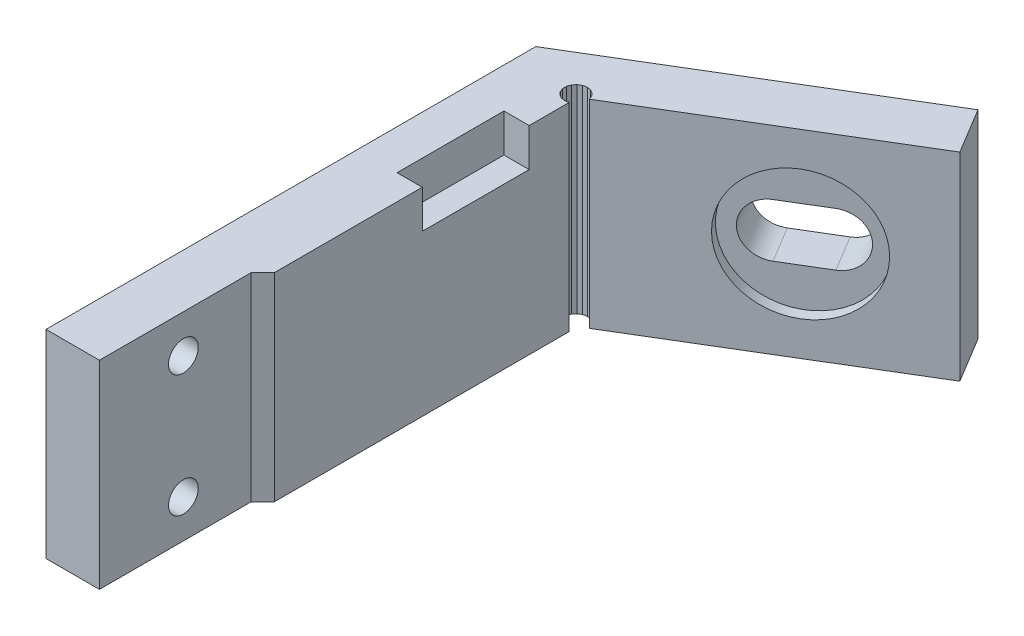
ISO-10303-21;
HEADER;
FILE_DESCRIPTION(('STEP AP214'),'2;1');
FILE_NAME('part.step','',(''),(''),'','','');
FILE_SCHEMA(('AUTOMOTIVE_DESIGN { 1 0 10303 214 1 1 1 1 }'));
ENDSEC;
DATA;
#1=APPLICATION_CONTEXT('core data for automotive mechanical design processes');
#2=APPLICATION_PROTOCOL_DEFINITION('international standard','automotive_design',2000,#1);
#3=PRODUCT_CONTEXT('',#1,'mechanical');
#4=PRODUCT('Part','Part','',(#3));
#5=PRODUCT_RELATED_PRODUCT_CATEGORY('part','',(#4));
#6=PRODUCT_DEFINITION_FORMATION('','',#4);
#7=PRODUCT_DEFINITION_CONTEXT('part definition',#1,'design');
#8=PRODUCT_DEFINITION('design','',#6,#7);
#9=PRODUCT_DEFINITION_SHAPE('','',#8);
#10=(LENGTH_UNIT() NAMED_UNIT(*) SI_UNIT(.MILLI.,.METRE.));
#11=(NAMED_UNIT(*) PLANE_ANGLE_UNIT() SI_UNIT($,.RADIAN.));
#12=(NAMED_UNIT(*) SI_UNIT($,.STERADIAN.) SOLID_ANGLE_UNIT());
#13=UNCERTAINTY_MEASURE_WITH_UNIT(LENGTH_MEASURE(1.E-05),#10,'distance_accuracy_value','');
#14=(GEOMETRIC_REPRESENTATION_CONTEXT(3) GLOBAL_UNCERTAINTY_ASSIGNED_CONTEXT((#13)) GLOBAL_UNIT_ASSIGNED_CONTEXT((#10,
#11,#12)) REPRESENTATION_CONTEXT('',''));
#15=CARTESIAN_POINT('',(0.,0.,0.));
#16=DIRECTION('',(0.,0.,1.));
#17=DIRECTION('',(1.,0.,0.));
#18=AXIS2_PLACEMENT_3D('',#15,#16,#17);
#19=CARTESIAN_POINT('',(20.8933360678516,-20.7,-41.4415255956456));
#20=DIRECTION('',(0.516709511568123,0.,0.856160779675775));
#21=DIRECTION('',(0.856160779675775,0.,-0.516709511568123));
#22=AXIS2_PLACEMENT_3D('',#19,#20,#21);
#23=CYLINDRICAL_SURFACE('',#22,3.5);
#24=CARTESIAN_POINT('',(16.7596599753066,-20.7,-48.2908118330518));
#25=DIRECTION('',(0.516709511568124,0.,0.856160779675775));
#26=DIRECTION('',(0.856160779675775,0.,-0.516709511568124));
#27=AXIS2_PLACEMENT_3D('',#24,#25,#26);
#28=CIRCLE('',#27,3.5);
#29=CARTESIAN_POINT('',(16.7596599753066,-17.2,-48.2908118330518));
#30=VERTEX_POINT('',#29);
#31=CARTESIAN_POINT('',(16.7596599753066,-24.2,-48.2908118330518));
#32=VERTEX_POINT('',#31);
#33=EDGE_CURVE('E251',#30,#32,#28,.F.);
#34=ORIENTED_EDGE('',*,*,#33,.T.);
#35=DIRECTION('',(-0.516709511568123,0.,-0.856160779675775));
#36=VECTOR('',#35,1.);
#37=CARTESIAN_POINT('',(20.8933360678516,-24.2,-41.4415255956456));
#38=LINE('',#37,#36);
#39=CARTESIAN_POINT('',(19.6015622889313,-24.2,-43.581927544835));
#40=VERTEX_POINT('',#39);
#41=EDGE_CURVE('E473',#40,#32,#38,.T.);
#42=ORIENTED_EDGE('',*,*,#41,.F.);
#43=CARTESIAN_POINT('',(19.6015622889313,-20.7,-43.581927544835));
#44=DIRECTION('',(0.516709511568124,0.,0.856160779675775));
#45=DIRECTION('',(0.856160779675775,0.,-0.516709511568124));
#46=AXIS2_PLACEMENT_3D('',#43,#44,#45);
#47=CIRCLE('',#46,3.5);
#48=CARTESIAN_POINT('',(19.6015622889313,-17.2,-43.581927544835));
#49=VERTEX_POINT('',#48);
#50=EDGE_CURVE('E260',#49,#40,#47,.F.);
#51=ORIENTED_EDGE('',*,*,#50,.F.);
#52=DIRECTION('',(-0.516709511568123,0.,-0.856160779675775));
#53=VECTOR('',#52,1.);
#54=CARTESIAN_POINT('',(20.8933360678516,-17.2,-41.4415255956456));
#55=LINE('',#54,#53);
#56=EDGE_CURVE('E475',#49,#30,#55,.T.);
#57=ORIENTED_EDGE('',*,*,#56,.T.);
#58=EDGE_LOOP('',(#34,#42,#51,#57));
#59=FACE_BOUND('',#58,.T.);
#60=ADVANCED_FACE('F43',(#59),#23,.F.);
#61=CARTESIAN_POINT('',(-8.92,-7.7,-32.7926427063358));
#62=DIRECTION('',(0.516709511568124,0.,0.856160779675775));
#63=DIRECTION('',(0.856160779675775,0.,-0.516709511568124));
#64=AXIS2_PLACEMENT_3D('',#61,#62,#63);
#65=PLANE('',#64);
#66=DIRECTION('',(-0.856160779675775,0.,0.516709511568124));
#67=VECTOR('',#66,1.);
#68=CARTESIAN_POINT('',(-8.92,-33.7,-32.7926427063358));
#69=LINE('',#68,#67);
#70=CARTESIAN_POINT('',(27.204821487351,-33.7,-54.5946678741829));
#71=VERTEX_POINT('',#70);
#72=CARTESIAN_POINT('',(-8.92,-33.7,-32.7926427063358));
#73=VERTEX_POINT('',#72);
#74=EDGE_CURVE('E343',#71,#73,#69,.T.);
#75=ORIENTED_EDGE('',*,*,#74,.T.);
#76=DIRECTION('',(0.,-1.,0.));
#77=VECTOR('',#76,1.);
#78=CARTESIAN_POINT('',(-8.92,-7.7,-32.7926427063358));
#79=LINE('',#78,#77);
#80=CARTESIAN_POINT('',(-8.92,-7.7,-32.7926427063358));
#81=VERTEX_POINT('',#80);
#82=EDGE_CURVE('E437',#81,#73,#79,.T.);
#83=ORIENTED_EDGE('',*,*,#82,.F.);
#84=DIRECTION('',(-0.856160779675775,0.,0.516709511568124));
#85=VECTOR('',#84,1.);
#86=CARTESIAN_POINT('',(-8.92,-7.7,-32.7926427063358));
#87=LINE('',#86,#85);
#88=CARTESIAN_POINT('',(27.204821487351,-7.7,-54.5946678741829));
#89=VERTEX_POINT('',#88);
#90=EDGE_CURVE('E300',#89,#81,#87,.T.);
#91=ORIENTED_EDGE('',*,*,#90,.F.);
#92=DIRECTION('',(0.,-1.,0.));
#93=VECTOR('',#92,1.);
#94=CARTESIAN_POINT('',(27.204821487351,-7.7,-54.5946678741829));
#95=LINE('',#94,#93);
#96=EDGE_CURVE('E445',#89,#71,#95,.T.);
#97=ORIENTED_EDGE('',*,*,#96,.T.);
#98=EDGE_LOOP('',(#75,#83,#91,#97));
#99=FACE_BOUND('',#98,.T.);
#100=DIRECTION('',(-0.856160779675775,0.,0.516709511568124));
#101=VECTOR('',#100,1.);
#102=CARTESIAN_POINT('',(-8.92,-24.2,-32.7926427063358));
#103=LINE('',#102,#101);
#104=CARTESIAN_POINT('',(11.6226952972519,-24.2,-45.190554763643));
#105=VERTEX_POINT('',#104);
#106=EDGE_CURVE('E70',#32,#105,#103,.T.);
#107=ORIENTED_EDGE('',*,*,#106,.F.);
#108=ORIENTED_EDGE('',*,*,#33,.F.);
#109=DIRECTION('',(-0.856160779675775,0.,0.516709511568124));
#110=VECTOR('',#109,1.);
#111=CARTESIAN_POINT('',(-8.92,-17.2,-32.7926427063358));
#112=LINE('',#111,#110);
#113=CARTESIAN_POINT('',(11.6226952972519,-17.2,-45.190554763643));
#114=VERTEX_POINT('',#113);
#115=EDGE_CURVE('E239',#30,#114,#112,.T.);
#116=ORIENTED_EDGE('',*,*,#115,.T.);
#117=CARTESIAN_POINT('',(11.6226952972519,-20.7,-45.190554763643));
#118=DIRECTION('',(0.516709511568124,0.,0.856160779675775));
#119=DIRECTION('',(0.856160779675775,0.,-0.516709511568124));
#120=AXIS2_PLACEMENT_3D('',#117,#118,#119);
#121=CIRCLE('',#120,3.5);
#122=EDGE_CURVE('E255',#105,#114,#121,.F.);
#123=ORIENTED_EDGE('',*,*,#122,.F.);
#124=EDGE_LOOP('',(#107,#108,#116,#123));
#125=FACE_BOUND('',#124,.T.);
#126=ADVANCED_FACE('F252',(#99,#125),#65,.F.);
#127=CARTESIAN_POINT('',(17.0330799499039,-20.7,-42.0317990101306));
#128=DIRECTION('',(0.516709511568124,0.,0.856160779675775));
#129=DIRECTION('',(0.856160779675775,0.,-0.516709511568124));
#130=AXIS2_PLACEMENT_3D('',#127,#128,#129);
#131=PLANE('',#130);
#132=CARTESIAN_POINT('',(17.0330799499039,-20.7,-42.0317990101306));
#133=DIRECTION('',(0.516709511568124,0.,0.856160779675775));
#134=DIRECTION('',(0.856160779675775,0.,-0.516709511568124));
#135=AXIS2_PLACEMENT_3D('',#132,#133,#134);
#136=CIRCLE('',#135,8.5);
#137=CARTESIAN_POINT('',(24.310446577148,-20.7,-46.4238298584597));
#138=VERTEX_POINT('',#137);
#139=EDGE_CURVE('E269',#138,#138,#136,.T.);
#140=ORIENTED_EDGE('',*,*,#139,.T.);
#141=EDGE_LOOP('',(#140));
#142=FACE_BOUND('',#141,.T.);
#143=ORIENTED_EDGE('',*,*,#50,.T.);
#144=DIRECTION('',(-0.856160779675775,0.,0.516709511568124));
#145=VECTOR('',#144,1.);
#146=CARTESIAN_POINT('',(17.0330799499039,-24.2,-42.0317990101306));
#147=LINE('',#146,#145);
#148=CARTESIAN_POINT('',(14.4645976108766,-24.2,-40.4816704754263));
#149=VERTEX_POINT('',#148);
#150=EDGE_CURVE('E253',#40,#149,#147,.T.);
#151=ORIENTED_EDGE('',*,*,#150,.T.);
#152=CARTESIAN_POINT('',(14.4645976108766,-20.7,-40.4816704754263));
#153=DIRECTION('',(0.516709511568124,0.,0.856160779675775));
#154=DIRECTION('',(0.856160779675775,0.,-0.516709511568124));
#155=AXIS2_PLACEMENT_3D('',#152,#153,#154);
#156=CIRCLE('',#155,3.5);
#157=CARTESIAN_POINT('',(14.4645976108766,-17.2,-40.4816704754263));
#158=VERTEX_POINT('',#157);
#159=EDGE_CURVE('E258',#149,#158,#156,.F.);
#160=ORIENTED_EDGE('',*,*,#159,.T.);
#161=DIRECTION('',(-0.856160779675775,0.,0.516709511568124));
#162=VECTOR('',#161,1.);
#163=CARTESIAN_POINT('',(17.0330799499039,-17.2,-42.0317990101306));
#164=LINE('',#163,#162);
#165=EDGE_CURVE('E58',#49,#158,#164,.T.);
#166=ORIENTED_EDGE('',*,*,#165,.F.);
#167=EDGE_LOOP('',(#143,#151,#160,#166));
#168=FACE_BOUND('',#167,.T.);
#169=ADVANCED_FACE('F476',(#142,#168),#131,.T.);
#170=CARTESIAN_POINT('',(15.7563713897969,-20.7,-38.3412685262368));
#171=DIRECTION('',(0.516709511568124,0.,0.856160779675775));
#172=DIRECTION('',(0.856160779675775,0.,-0.516709511568124));
#173=AXIS2_PLACEMENT_3D('',#170,#171,#172);
#174=CYLINDRICAL_SURFACE('',#173,3.5);
#175=DIRECTION('',(0.516709511568124,0.,0.856160779675775));
#176=VECTOR('',#175,1.);
#177=CARTESIAN_POINT('',(15.7563713897969,-24.2,-38.3412685262368));
#178=LINE('',#177,#176);
#179=EDGE_CURVE('E11',#105,#149,#178,.T.);
#180=ORIENTED_EDGE('',*,*,#179,.F.);
#181=ORIENTED_EDGE('',*,*,#122,.T.);
#182=DIRECTION('',(0.516709511568124,0.,0.856160779675775));
#183=VECTOR('',#182,1.);
#184=CARTESIAN_POINT('',(15.7563713897969,-17.2,-38.3412685262368));
#185=LINE('',#184,#183);
#186=EDGE_CURVE('E55',#114,#158,#185,.T.);
#187=ORIENTED_EDGE('',*,*,#186,.T.);
#188=ORIENTED_EDGE('',*,*,#159,.F.);
#189=EDGE_LOOP('',(#180,#181,#187,#188));
#190=FACE_BOUND('',#189,.T.);
#191=ADVANCED_FACE('F256',(#190),#174,.F.);
#192=CARTESIAN_POINT('',(30.8217880683279,-7.7,-48.6015424164524));
#193=DIRECTION('',(-0.516709511568124,0.,-0.856160779675775));
#194=DIRECTION('',(-0.856160779675775,0.,0.516709511568124));
#195=AXIS2_PLACEMENT_3D('',#192,#193,#194);
#196=PLANE('',#195);
#197=CARTESIAN_POINT('',(17.8081442172561,-20.7,-40.747557840617));
#198=DIRECTION('',(-0.516709511568124,0.,-0.856160779675775));
#199=DIRECTION('',(-0.856160779675775,0.,0.516709511568124));
#200=AXIS2_PLACEMENT_3D('',#197,#198,#199);
#201=CIRCLE('',#200,8.5);
#202=CARTESIAN_POINT('',(10.530777590012,-20.7,-36.3555269922879));
#203=VERTEX_POINT('',#202);
#204=EDGE_CURVE('E268',#203,#203,#201,.F.);
#205=ORIENTED_EDGE('',*,*,#204,.F.);
#206=EDGE_LOOP('',(#205));
#207=FACE_BOUND('',#206,.T.);
#208=DIRECTION('',(0.856160779675775,0.,-0.516709511568124));
#209=VECTOR('',#208,1.);
#210=CARTESIAN_POINT('',(30.8217880683279,-33.7,-48.6015424164524));
#211=LINE('',#210,#209);
#212=CARTESIAN_POINT('',(0.551289683386541,-33.7,-30.3327139362108));
#213=VERTEX_POINT('',#212);
#214=CARTESIAN_POINT('',(30.8217880683279,-33.7,-48.6015424164524));
#215=VERTEX_POINT('',#214);
#216=EDGE_CURVE('E288',#213,#215,#211,.T.);
#217=ORIENTED_EDGE('',*,*,#216,.T.);
#218=DIRECTION('',(0.,-1.,0.));
#219=VECTOR('',#218,1.);
#220=CARTESIAN_POINT('',(30.8217880683279,-7.7,-48.6015424164524));
#221=LINE('',#220,#219);
#222=CARTESIAN_POINT('',(30.8217880683279,-7.7,-48.6015424164524));
#223=VERTEX_POINT('',#222);
#224=EDGE_CURVE('E444',#223,#215,#221,.T.);
#225=ORIENTED_EDGE('',*,*,#224,.F.);
#226=DIRECTION('',(0.856160779675775,0.,-0.516709511568124));
#227=VECTOR('',#226,1.);
#228=CARTESIAN_POINT('',(30.8217880683279,-7.7,-48.6015424164524));
#229=LINE('',#228,#227);
#230=CARTESIAN_POINT('',(0.551289683386541,-7.7,-30.3327139362108));
#231=VERTEX_POINT('',#230);
#232=EDGE_CURVE('E293',#231,#223,#229,.T.);
#233=ORIENTED_EDGE('',*,*,#232,.F.);
#234=DIRECTION('',(0.,-1.,0.));
#235=VECTOR('',#234,1.);
#236=CARTESIAN_POINT('',(0.551289683386541,-7.7,-30.3327139362108));
#237=LINE('',#236,#235);
#238=EDGE_CURVE('E339',#231,#213,#237,.T.);
#239=ORIENTED_EDGE('',*,*,#238,.T.);
#240=EDGE_LOOP('',(#217,#225,#233,#239));
#241=FACE_BOUND('',#240,.T.);
#242=ADVANCED_FACE('F44',(#207,#241),#196,.F.);
#243=CARTESIAN_POINT('',(27.204821487351,-7.7,-54.5946678741829));
#244=DIRECTION('',(-0.856160779675776,0.,0.516709511568123));
#245=DIRECTION('',(0.516709511568123,0.,0.856160779675776));
#246=AXIS2_PLACEMENT_3D('',#243,#244,#245);
#247=PLANE('',#246);
#248=DIRECTION('',(-0.516709511568123,0.,-0.856160779675776));
#249=VECTOR('',#248,1.);
#250=CARTESIAN_POINT('',(27.204821487351,-33.7,-54.5946678741829));
#251=LINE('',#250,#249);
#252=EDGE_CURVE('E341',#215,#71,#251,.T.);
#253=ORIENTED_EDGE('',*,*,#252,.T.);
#254=ORIENTED_EDGE('',*,*,#96,.F.);
#255=DIRECTION('',(-0.516709511568123,0.,-0.856160779675776));
#256=VECTOR('',#255,1.);
#257=CARTESIAN_POINT('',(27.204821487351,-7.7,-54.5946678741829));
#258=LINE('',#257,#256);
#259=EDGE_CURVE('E295',#223,#89,#258,.T.);
#260=ORIENTED_EDGE('',*,*,#259,.F.);
#261=ORIENTED_EDGE('',*,*,#224,.T.);
#262=EDGE_LOOP('',(#253,#254,#260,#261));
#263=FACE_BOUND('',#262,.T.);
#264=ADVANCED_FACE('F598',(#263),#247,.F.);
#265=CARTESIAN_POINT('',(-8.92,-7.7,31.37));
#266=DIRECTION('',(1.,0.,0.));
#267=DIRECTION('',(0.,0.,-1.));
#268=AXIS2_PLACEMENT_3D('',#265,#266,#267);
#269=PLANE('',#268);
#270=CARTESIAN_POINT('',(-8.92,-28.7,20.375));
#271=DIRECTION('',(1.,0.,0.));
#272=DIRECTION('',(0.,0.,-1.));
#273=AXIS2_PLACEMENT_3D('',#270,#271,#272);
#274=CIRCLE('',#273,1.95);
#275=CARTESIAN_POINT('',(-8.92,-28.7,18.425));
#276=VERTEX_POINT('',#275);
#277=EDGE_CURVE('E469',#276,#276,#274,.T.);
#278=ORIENTED_EDGE('',*,*,#277,.T.);
#279=EDGE_LOOP('',(#278));
#280=FACE_BOUND('',#279,.T.);
#281=CARTESIAN_POINT('',(-8.92,-12.7,20.375));
#282=DIRECTION('',(1.,0.,0.));
#283=DIRECTION('',(0.,0.,-1.));
#284=AXIS2_PLACEMENT_3D('',#281,#282,#283);
#285=CIRCLE('',#284,1.95);
#286=CARTESIAN_POINT('',(-8.92,-12.7,18.425));
#287=VERTEX_POINT('',#286);
#288=EDGE_CURVE('E462',#287,#287,#285,.T.);
#289=ORIENTED_EDGE('',*,*,#288,.T.);
#290=EDGE_LOOP('',(#289));
#291=FACE_BOUND('',#290,.T.);
#292=DIRECTION('',(0.,0.,1.));
#293=VECTOR('',#292,1.);
#294=CARTESIAN_POINT('',(-8.92,-33.7,31.37));
#295=LINE('',#294,#293);
#296=CARTESIAN_POINT('',(-8.92,-33.7,31.37));
#297=VERTEX_POINT('',#296);
#298=EDGE_CURVE('E347',#73,#297,#295,.T.);
#299=ORIENTED_EDGE('',*,*,#298,.T.);
#300=DIRECTION('',(0.,-1.,0.));
#301=VECTOR('',#300,1.);
#302=CARTESIAN_POINT('',(-8.92,-7.7,31.37));
#303=LINE('',#302,#301);
#304=CARTESIAN_POINT('',(-8.92,-7.7,31.37));
#305=VERTEX_POINT('',#304);
#306=EDGE_CURVE('E436',#305,#297,#303,.T.);
#307=ORIENTED_EDGE('',*,*,#306,.F.);
#308=DIRECTION('',(0.,0.,1.));
#309=VECTOR('',#308,1.);
#310=CARTESIAN_POINT('',(-8.92,-7.7,31.37));
#311=LINE('',#310,#309);
#312=EDGE_CURVE('E299',#81,#305,#311,.T.);
#313=ORIENTED_EDGE('',*,*,#312,.F.);
#314=ORIENTED_EDGE('',*,*,#82,.T.);
#315=EDGE_LOOP('',(#299,#307,#313,#314));
#316=FACE_BOUND('',#315,.T.);
#317=ADVANCED_FACE('F600',(#280,#291,#316),#269,.F.);
#318=CARTESIAN_POINT('',(-1.91999999999999,-7.7,31.37));
#319=DIRECTION('',(0.,0.,-1.));
#320=DIRECTION('',(-1.,0.,0.));
#321=AXIS2_PLACEMENT_3D('',#318,#319,#320);
#322=PLANE('',#321);
#323=DIRECTION('',(1.,0.,0.));
#324=VECTOR('',#323,1.);
#325=CARTESIAN_POINT('',(-1.91999999999999,-33.7,31.37));
#326=LINE('',#325,#324);
#327=CARTESIAN_POINT('',(-1.91999999999999,-33.7,31.37));
#328=VERTEX_POINT('',#327);
#329=EDGE_CURVE('E348',#297,#328,#326,.T.);
#330=ORIENTED_EDGE('',*,*,#329,.T.);
#331=DIRECTION('',(0.,-1.,0.));
#332=VECTOR('',#331,1.);
#333=CARTESIAN_POINT('',(-1.91999999999999,-7.7,31.37));
#334=LINE('',#333,#332);
#335=CARTESIAN_POINT('',(-1.91999999999999,-7.7,31.37));
#336=VERTEX_POINT('',#335);
#337=EDGE_CURVE('E433',#336,#328,#334,.T.);
#338=ORIENTED_EDGE('',*,*,#337,.F.);
#339=DIRECTION('',(1.,0.,0.));
#340=VECTOR('',#339,1.);
#341=CARTESIAN_POINT('',(-1.91999999999999,-7.7,31.37));
#342=LINE('',#341,#340);
#343=EDGE_CURVE('E301',#305,#336,#342,.T.);
#344=ORIENTED_EDGE('',*,*,#343,.F.);
#345=ORIENTED_EDGE('',*,*,#306,.T.);
#346=EDGE_LOOP('',(#330,#338,#344,#345));
#347=FACE_BOUND('',#346,.T.);
#348=ADVANCED_FACE('F595',(#347),#322,.F.);
#349=CARTESIAN_POINT('',(-1.91999999999999,-7.7,11.5));
#350=DIRECTION('',(-1.,0.,0.));
#351=DIRECTION('',(0.,0.,1.));
#352=AXIS2_PLACEMENT_3D('',#349,#350,#351);
#353=PLANE('',#352);
#354=CARTESIAN_POINT('',(-1.91999999999999,-28.7,20.375));
#355=DIRECTION('',(-1.,0.,0.));
#356=DIRECTION('',(0.,0.,1.));
#357=AXIS2_PLACEMENT_3D('',#354,#355,#356);
#358=CIRCLE('',#357,1.95);
#359=CARTESIAN_POINT('',(-1.91999999999999,-28.7,22.325));
#360=VERTEX_POINT('',#359);
#361=EDGE_CURVE('E50',#360,#360,#358,.T.);
#362=ORIENTED_EDGE('',*,*,#361,.T.);
#363=EDGE_LOOP('',(#362));
#364=FACE_BOUND('',#363,.T.);
#365=CARTESIAN_POINT('',(-1.91999999999999,-12.7,20.375));
#366=DIRECTION('',(-1.,0.,0.));
#367=DIRECTION('',(0.,0.,1.));
#368=AXIS2_PLACEMENT_3D('',#365,#366,#367);
#369=CIRCLE('',#368,1.95);
#370=CARTESIAN_POINT('',(-1.91999999999999,-12.7,22.325));
#371=VERTEX_POINT('',#370);
#372=EDGE_CURVE('E459',#371,#371,#369,.T.);
#373=ORIENTED_EDGE('',*,*,#372,.T.);
#374=EDGE_LOOP('',(#373));
#375=FACE_BOUND('',#374,.T.);
#376=DIRECTION('',(0.,0.,-1.));
#377=VECTOR('',#376,1.);
#378=CARTESIAN_POINT('',(-1.91999999999999,-33.7,11.5));
#379=LINE('',#378,#377);
#380=CARTESIAN_POINT('',(-1.91999999999999,-33.7,11.5));
#381=VERTEX_POINT('',#380);
#382=EDGE_CURVE('E346',#328,#381,#379,.T.);
#383=ORIENTED_EDGE('',*,*,#382,.T.);
#384=DIRECTION('',(0.,-1.,0.));
#385=VECTOR('',#384,1.);
#386=CARTESIAN_POINT('',(-1.91999999999999,-7.7,11.5));
#387=LINE('',#386,#385);
#388=CARTESIAN_POINT('',(-1.91999999999999,-7.7,11.5));
#389=VERTEX_POINT('',#388);
#390=EDGE_CURVE('E427',#389,#381,#387,.T.);
#391=ORIENTED_EDGE('',*,*,#390,.F.);
#392=DIRECTION('',(0.,0.,-1.));
#393=VECTOR('',#392,1.);
#394=CARTESIAN_POINT('',(-1.91999999999999,-7.7,11.5));
#395=LINE('',#394,#393);
#396=EDGE_CURVE('E303',#336,#389,#395,.T.);
#397=ORIENTED_EDGE('',*,*,#396,.F.);
#398=ORIENTED_EDGE('',*,*,#337,.T.);
#399=EDGE_LOOP('',(#383,#391,#397,#398));
#400=FACE_BOUND('',#399,.T.);
#401=ADVANCED_FACE('F589',(#364,#375,#400),#353,.F.);
#402=CARTESIAN_POINT('',(-0.4,-7.7,9.98));
#403=DIRECTION('',(-0.707106781186547,0.,-0.707106781186548));
#404=DIRECTION('',(-0.707106781186548,0.,0.707106781186547));
#405=AXIS2_PLACEMENT_3D('',#402,#403,#404);
#406=PLANE('',#405);
#407=DIRECTION('',(0.707106781186548,0.,-0.707106781186547));
#408=VECTOR('',#407,1.);
#409=CARTESIAN_POINT('',(-0.4,-33.7,9.98));
#410=LINE('',#409,#408);
#411=CARTESIAN_POINT('',(-0.4,-33.7,9.98));
#412=VERTEX_POINT('',#411);
#413=EDGE_CURVE('E354',#381,#412,#410,.T.);
#414=ORIENTED_EDGE('',*,*,#413,.T.);
#415=DIRECTION('',(0.,-1.,0.));
#416=VECTOR('',#415,1.);
#417=CARTESIAN_POINT('',(-0.4,-7.7,9.98));
#418=LINE('',#417,#416);
#419=CARTESIAN_POINT('',(-0.4,-7.7,9.98));
#420=VERTEX_POINT('',#419);
#421=EDGE_CURVE('E430',#420,#412,#418,.T.);
#422=ORIENTED_EDGE('',*,*,#421,.F.);
#423=DIRECTION('',(0.707106781186548,0.,-0.707106781186547));
#424=VECTOR('',#423,1.);
#425=CARTESIAN_POINT('',(-0.4,-7.7,9.98));
#426=LINE('',#425,#424);
#427=EDGE_CURVE('E304',#389,#420,#426,.T.);
#428=ORIENTED_EDGE('',*,*,#427,.F.);
#429=ORIENTED_EDGE('',*,*,#390,.T.);
#430=EDGE_LOOP('',(#414,#422,#428,#429));
#431=FACE_BOUND('',#430,.T.);
#432=ADVANCED_FACE('F582',(#431),#406,.F.);
#433=CARTESIAN_POINT('',(-0.399999999999999,-7.7,-28.6474812727905));
#434=DIRECTION('',(-1.,0.,0.));
#435=DIRECTION('',(0.,0.,1.));
#436=AXIS2_PLACEMENT_3D('',#433,#434,#435);
#437=PLANE('',#436);
#438=DIRECTION('',(0.,0.,1.));
#439=VECTOR('',#438,1.);
#440=CARTESIAN_POINT('',(-0.399999999999999,-12.7,-28.6474812727905));
#441=LINE('',#440,#439);
#442=CARTESIAN_POINT('',(-0.4,-12.7,-23.4));
#443=VERTEX_POINT('',#442);
#444=CARTESIAN_POINT('',(-0.400000000000001,-12.7,-9.4));
#445=VERTEX_POINT('',#444);
#446=EDGE_CURVE('E246',#443,#445,#441,.T.);
#447=ORIENTED_EDGE('',*,*,#446,.T.);
#448=DIRECTION('',(0.,1.,0.));
#449=VECTOR('',#448,1.);
#450=CARTESIAN_POINT('',(-0.4,-7.7,-9.4));
#451=LINE('',#450,#449);
#452=CARTESIAN_POINT('',(-0.4,-7.7,-9.4));
#453=VERTEX_POINT('',#452);
#454=EDGE_CURVE('E289',#445,#453,#451,.T.);
#455=ORIENTED_EDGE('',*,*,#454,.T.);
#456=DIRECTION('',(0.,0.,-1.));
#457=VECTOR('',#456,1.);
#458=CARTESIAN_POINT('',(-0.399999999999999,-7.7,-28.6474812727905));
#459=LINE('',#458,#457);
#460=EDGE_CURVE('E308',#420,#453,#459,.T.);
#461=ORIENTED_EDGE('',*,*,#460,.F.);
#462=ORIENTED_EDGE('',*,*,#421,.T.);
#463=DIRECTION('',(0.,0.,-1.));
#464=VECTOR('',#463,1.);
#465=CARTESIAN_POINT('',(-0.399999999999999,-33.7,-28.6474812727905));
#466=LINE('',#465,#464);
#467=CARTESIAN_POINT('',(-0.399999999999999,-33.7,-28.6474812727905));
#468=VERTEX_POINT('',#467);
#469=EDGE_CURVE('E351',#412,#468,#466,.T.);
#470=ORIENTED_EDGE('',*,*,#469,.T.);
#471=DIRECTION('',(0.,-1.,0.));
#472=VECTOR('',#471,1.);
#473=CARTESIAN_POINT('',(-0.399999999999999,-7.7,-28.6474812727905));
#474=LINE('',#473,#472);
#475=CARTESIAN_POINT('',(-0.399999999999999,-7.7,-28.6474812727905));
#476=VERTEX_POINT('',#475);
#477=EDGE_CURVE('E425',#476,#468,#474,.T.);
#478=ORIENTED_EDGE('',*,*,#477,.F.);
#479=CARTESIAN_POINT('',(-0.4,-7.7,-23.4));
#480=VERTEX_POINT('',#479);
#481=EDGE_CURVE('E310',#480,#476,#459,.T.);
#482=ORIENTED_EDGE('',*,*,#481,.F.);
#483=DIRECTION('',(0.,-1.,0.));
#484=VECTOR('',#483,1.);
#485=CARTESIAN_POINT('',(-0.399999999999999,-7.7,-23.4));
#486=LINE('',#485,#484);
#487=EDGE_CURVE('E285',#480,#443,#486,.T.);
#488=ORIENTED_EDGE('',*,*,#487,.T.);
#489=EDGE_LOOP('',(#447,#455,#461,#462,#470,#478,#482,#488));
#490=FACE_BOUND('',#489,.T.);
#491=ADVANCED_FACE('F584',(#490),#437,.F.);
#492=CARTESIAN_POINT('',(-0.9117726301264,-7.7,-28.5535752199289));
#493=DIRECTION('',(0.180478610290129,0.,0.983578909507389));
#494=DIRECTION('',(0.983578909507389,0.,-0.180478610290129));
#495=AXIS2_PLACEMENT_3D('',#492,#493,#494);
#496=PLANE('',#495);
#497=DIRECTION('',(-0.983578909507389,0.,0.180478610290129));
#498=VECTOR('',#497,1.);
#499=CARTESIAN_POINT('',(-0.9117726301264,-33.7,-28.5535752199289));
#500=LINE('',#499,#498);
#501=CARTESIAN_POINT('',(-0.9117726301264,-33.7,-28.5535752199289));
#502=VERTEX_POINT('',#501);
#503=EDGE_CURVE('E358',#468,#502,#500,.T.);
#504=ORIENTED_EDGE('',*,*,#503,.T.);
#505=DIRECTION('',(0.,-1.,0.));
#506=VECTOR('',#505,1.);
#507=CARTESIAN_POINT('',(-0.9117726301264,-7.7,-28.5535752199289));
#508=LINE('',#507,#506);
#509=CARTESIAN_POINT('',(-0.9117726301264,-7.7,-28.5535752199289));
#510=VERTEX_POINT('',#509);
#511=EDGE_CURVE('E423',#510,#502,#508,.T.);
#512=ORIENTED_EDGE('',*,*,#511,.F.);
#513=DIRECTION('',(-0.983578909507389,0.,0.180478610290129));
#514=VECTOR('',#513,1.);
#515=CARTESIAN_POINT('',(-0.9117726301264,-7.7,-28.5535752199289));
#516=LINE('',#515,#514);
#517=EDGE_CURVE('E311',#476,#510,#516,.T.);
#518=ORIENTED_EDGE('',*,*,#517,.F.);
#519=ORIENTED_EDGE('',*,*,#477,.T.);
#520=EDGE_LOOP('',(#504,#512,#518,#519));
#521=FACE_BOUND('',#520,.T.);
#522=ADVANCED_FACE('F580',(#521),#496,.F.);
#523=CARTESIAN_POINT('',(-1.42483619137929,-7.7,-28.640150931448));
#524=DIRECTION('',(-0.166390382980746,0.,0.986059957838022));
#525=DIRECTION('',(0.986059957838022,0.,0.166390382980746));
#526=AXIS2_PLACEMENT_3D('',#523,#524,#525);
#527=PLANE('',#526);
#528=DIRECTION('',(-0.986059957838022,0.,-0.166390382980746));
#529=VECTOR('',#528,1.);
#530=CARTESIAN_POINT('',(-1.42483619137929,-33.7,-28.640150931448));
#531=LINE('',#530,#529);
#532=CARTESIAN_POINT('',(-1.42483619137929,-33.7,-28.640150931448));
#533=VERTEX_POINT('',#532);
#534=EDGE_CURVE('E356',#502,#533,#531,.T.);
#535=ORIENTED_EDGE('',*,*,#534,.T.);
#536=DIRECTION('',(0.,-1.,0.));
#537=VECTOR('',#536,1.);
#538=CARTESIAN_POINT('',(-1.42483619137929,-7.7,-28.640150931448));
#539=LINE('',#538,#537);
#540=CARTESIAN_POINT('',(-1.42483619137929,-7.7,-28.640150931448));
#541=VERTEX_POINT('',#540);
#542=EDGE_CURVE('E420',#541,#533,#539,.T.);
#543=ORIENTED_EDGE('',*,*,#542,.F.);
#544=DIRECTION('',(-0.986059957838022,0.,-0.166390382980746));
#545=VECTOR('',#544,1.);
#546=CARTESIAN_POINT('',(-1.42483619137929,-7.7,-28.640150931448));
#547=LINE('',#546,#545);
#548=EDGE_CURVE('E312',#510,#541,#547,.T.);
#549=ORIENTED_EDGE('',*,*,#548,.F.);
#550=ORIENTED_EDGE('',*,*,#511,.T.);
#551=EDGE_LOOP('',(#535,#543,#549,#550));
#552=FACE_BOUND('',#551,.T.);
#553=ADVANCED_FACE('F572',(#552),#527,.F.);
#554=CARTESIAN_POINT('',(-1.87745669344831,-7.7,-28.8967912494367));
#555=DIRECTION('',(-0.493238577531129,0.,0.869894077250253));
#556=DIRECTION('',(0.869894077250253,0.,0.493238577531129));
#557=AXIS2_PLACEMENT_3D('',#554,#555,#556);
#558=PLANE('',#557);
#559=DIRECTION('',(-0.869894077250252,0.,-0.493238577531129));
#560=VECTOR('',#559,1.);
#561=CARTESIAN_POINT('',(-1.87745669344831,-33.7,-28.8967912494367));
#562=LINE('',#561,#560);
#563=CARTESIAN_POINT('',(-1.87745669344831,-33.7,-28.8967912494367));
#564=VERTEX_POINT('',#563);
#565=EDGE_CURVE('E359',#533,#564,#562,.T.);
#566=ORIENTED_EDGE('',*,*,#565,.T.);
#567=DIRECTION('',(0.,-1.,0.));
#568=VECTOR('',#567,1.);
#569=CARTESIAN_POINT('',(-1.87745669344831,-7.7,-28.8967912494367));
#570=LINE('',#569,#568);
#571=CARTESIAN_POINT('',(-1.87745669344831,-7.7,-28.8967912494367));
#572=VERTEX_POINT('',#571);
#573=EDGE_CURVE('E411',#572,#564,#570,.T.);
#574=ORIENTED_EDGE('',*,*,#573,.F.);
#575=DIRECTION('',(-0.869894077250252,0.,-0.493238577531129));
#576=VECTOR('',#575,1.);
#577=CARTESIAN_POINT('',(-1.87745669344831,-7.7,-28.8967912494367));
#578=LINE('',#577,#576);
#579=EDGE_CURVE('E314',#541,#572,#578,.T.);
#580=ORIENTED_EDGE('',*,*,#579,.F.);
#581=ORIENTED_EDGE('',*,*,#542,.T.);
#582=EDGE_LOOP('',(#566,#574,#580,#581));
#583=FACE_BOUND('',#582,.T.);
#584=ADVANCED_FACE('F567',(#583),#558,.F.);
#585=CARTESIAN_POINT('',(-2.21517291203457,-7.7,-29.2926161190625));
#586=DIRECTION('',(-0.760738208149895,0.,0.649058840676935));
#587=DIRECTION('',(0.649058840676935,0.,0.760738208149895));
#588=AXIS2_PLACEMENT_3D('',#585,#586,#587);
#589=PLANE('',#588);
#590=DIRECTION('',(-0.649058840676935,0.,-0.760738208149895));
#591=VECTOR('',#590,1.);
#592=CARTESIAN_POINT('',(-2.21517291203457,-33.7,-29.2926161190625));
#593=LINE('',#592,#591);
#594=CARTESIAN_POINT('',(-2.21517291203457,-33.7,-29.2926161190625));
#595=VERTEX_POINT('',#594);
#596=EDGE_CURVE('E365',#564,#595,#593,.T.);
#597=ORIENTED_EDGE('',*,*,#596,.T.);
#598=DIRECTION('',(0.,-1.,0.));
#599=VECTOR('',#598,1.);
#600=CARTESIAN_POINT('',(-2.21517291203457,-7.7,-29.2926161190625));
#601=LINE('',#600,#599);
#602=CARTESIAN_POINT('',(-2.21517291203457,-7.7,-29.2926161190625));
#603=VERTEX_POINT('',#602);
#604=EDGE_CURVE('E415',#603,#595,#601,.T.);
#605=ORIENTED_EDGE('',*,*,#604,.F.);
#606=DIRECTION('',(-0.649058840676935,0.,-0.760738208149895));
#607=VECTOR('',#606,1.);
#608=CARTESIAN_POINT('',(-2.21517291203457,-7.7,-29.2926161190625));
#609=LINE('',#608,#607);
#610=EDGE_CURVE('E320',#572,#603,#609,.T.);
#611=ORIENTED_EDGE('',*,*,#610,.F.);
#612=ORIENTED_EDGE('',*,*,#573,.T.);
#613=EDGE_LOOP('',(#597,#605,#611,#612));
#614=FACE_BOUND('',#613,.T.);
#615=ADVANCED_FACE('F564',(#614),#589,.F.);
#616=CARTESIAN_POINT('',(-2.39734939504136,-7.7,-29.7799982081362));
#617=DIRECTION('',(-0.936702581312546,0.,0.350126083236328));
#618=DIRECTION('',(0.350126083236328,0.,0.936702581312547));
#619=AXIS2_PLACEMENT_3D('',#616,#617,#618);
#620=PLANE('',#619);
#621=DIRECTION('',(-0.350126083236328,0.,-0.936702581312546));
#622=VECTOR('',#621,1.);
#623=CARTESIAN_POINT('',(-2.39734939504136,-33.7,-29.7799982081362));
#624=LINE('',#623,#622);
#625=CARTESIAN_POINT('',(-2.39734939504136,-33.7,-29.7799982081362));
#626=VERTEX_POINT('',#625);
#627=EDGE_CURVE('E364',#595,#626,#624,.T.);
#628=ORIENTED_EDGE('',*,*,#627,.T.);
#629=DIRECTION('',(0.,-1.,0.));
#630=VECTOR('',#629,1.);
#631=CARTESIAN_POINT('',(-2.39734939504136,-7.7,-29.7799982081362));
#632=LINE('',#631,#630);
#633=CARTESIAN_POINT('',(-2.39734939504136,-7.7,-29.7799982081362));
#634=VERTEX_POINT('',#633);
#635=EDGE_CURVE('E408',#634,#626,#632,.T.);
#636=ORIENTED_EDGE('',*,*,#635,.F.);
#637=DIRECTION('',(-0.350126083236328,0.,-0.936702581312546));
#638=VECTOR('',#637,1.);
#639=CARTESIAN_POINT('',(-2.39734939504136,-7.7,-29.7799982081362));
#640=LINE('',#639,#638);
#641=EDGE_CURVE('E316',#603,#634,#640,.T.);
#642=ORIENTED_EDGE('',*,*,#641,.F.);
#643=ORIENTED_EDGE('',*,*,#604,.T.);
#644=EDGE_LOOP('',(#628,#636,#642,#643));
#645=FACE_BOUND('',#644,.T.);
#646=ADVANCED_FACE('F561',(#645),#620,.F.);
#647=CARTESIAN_POINT('',(-2.4020658930375,-7.7,-30.3002936303313));
#648=DIRECTION('',(-0.999958915071245,0.,0.00906466599160435));
#649=DIRECTION('',(0.00906466599160435,0.,0.999958915071245));
#650=AXIS2_PLACEMENT_3D('',#647,#648,#649);
#651=PLANE('',#650);
#652=DIRECTION('',(-0.00906466599160435,0.,-0.999958915071245));
#653=VECTOR('',#652,1.);
#654=CARTESIAN_POINT('',(-2.4020658930375,-33.7,-30.3002936303313));
#655=LINE('',#654,#653);
#656=CARTESIAN_POINT('',(-2.4020658930375,-33.7,-30.3002936303313));
#657=VERTEX_POINT('',#656);
#658=EDGE_CURVE('E366',#626,#657,#655,.T.);
#659=ORIENTED_EDGE('',*,*,#658,.T.);
#660=DIRECTION('',(0.,-1.,0.));
#661=VECTOR('',#660,1.);
#662=CARTESIAN_POINT('',(-2.4020658930375,-7.7,-30.3002936303313));
#663=LINE('',#662,#661);
#664=CARTESIAN_POINT('',(-2.4020658930375,-7.7,-30.3002936303313));
#665=VERTEX_POINT('',#664);
#666=EDGE_CURVE('E409',#665,#657,#663,.T.);
#667=ORIENTED_EDGE('',*,*,#666,.F.);
#668=DIRECTION('',(-0.00906466599160435,0.,-0.999958915071245));
#669=VECTOR('',#668,1.);
#670=CARTESIAN_POINT('',(-2.4020658930375,-7.7,-30.3002936303313));
#671=LINE('',#670,#669);
#672=EDGE_CURVE('E324',#634,#665,#671,.T.);
#673=ORIENTED_EDGE('',*,*,#672,.F.);
#674=ORIENTED_EDGE('',*,*,#635,.T.);
#675=EDGE_LOOP('',(#659,#667,#673,#674));
#676=FACE_BOUND('',#675,.T.);
#677=ADVANCED_FACE('F560',(#676),#651,.F.);
#678=CARTESIAN_POINT('',(-2.22875489691968,-7.7,-30.7908982270639));
#679=DIRECTION('',(-0.942895938249778,0.,-0.333087450427166));
#680=DIRECTION('',(-0.333087450427166,0.,0.942895938249778));
#681=AXIS2_PLACEMENT_3D('',#678,#679,#680);
#682=PLANE('',#681);
#683=DIRECTION('',(0.333087450427166,0.,-0.942895938249778));
#684=VECTOR('',#683,1.);
#685=CARTESIAN_POINT('',(-2.22875489691968,-33.7,-30.7908982270639));
#686=LINE('',#685,#684);
#687=CARTESIAN_POINT('',(-2.22875489691968,-33.7,-30.7908982270639));
#688=VERTEX_POINT('',#687);
#689=EDGE_CURVE('E368',#657,#688,#686,.T.);
#690=ORIENTED_EDGE('',*,*,#689,.T.);
#691=DIRECTION('',(0.,-1.,0.));
#692=VECTOR('',#691,1.);
#693=CARTESIAN_POINT('',(-2.22875489691968,-7.7,-30.7908982270639));
#694=LINE('',#693,#692);
#695=CARTESIAN_POINT('',(-2.22875489691968,-7.7,-30.7908982270639));
#696=VERTEX_POINT('',#695);
#697=EDGE_CURVE('E401',#696,#688,#694,.T.);
#698=ORIENTED_EDGE('',*,*,#697,.F.);
#699=DIRECTION('',(0.333087450427166,0.,-0.942895938249778));
#700=VECTOR('',#699,1.);
#701=CARTESIAN_POINT('',(-2.22875489691968,-7.7,-30.7908982270639));
#702=LINE('',#701,#700);
#703=EDGE_CURVE('E325',#665,#696,#702,.T.);
#704=ORIENTED_EDGE('',*,*,#703,.F.);
#705=ORIENTED_EDGE('',*,*,#666,.T.);
#706=EDGE_LOOP('',(#690,#698,#704,#705));
#707=FACE_BOUND('',#706,.T.);
#708=ADVANCED_FACE('F551',(#707),#682,.F.);
#709=CARTESIAN_POINT('',(-1.89826992302198,-7.7,-31.1927803661774));
#710=DIRECTION('',(-0.772379710970551,0.,-0.635161067825358));
#711=DIRECTION('',(-0.635161067825358,0.,0.772379710970551));
#712=AXIS2_PLACEMENT_3D('',#709,#710,#711);
#713=PLANE('',#712);
#714=DIRECTION('',(0.635161067825358,0.,-0.772379710970551));
#715=VECTOR('',#714,1.);
#716=CARTESIAN_POINT('',(-1.89826992302198,-33.7,-31.1927803661774));
#717=LINE('',#716,#715);
#718=CARTESIAN_POINT('',(-1.89826992302198,-33.7,-31.1927803661774));
#719=VERTEX_POINT('',#718);
#720=EDGE_CURVE('E369',#688,#719,#717,.T.);
#721=ORIENTED_EDGE('',*,*,#720,.T.);
#722=DIRECTION('',(0.,-1.,0.));
#723=VECTOR('',#722,1.);
#724=CARTESIAN_POINT('',(-1.89826992302198,-7.7,-31.1927803661774));
#725=LINE('',#724,#723);
#726=CARTESIAN_POINT('',(-1.89826992302198,-7.7,-31.1927803661774));
#727=VERTEX_POINT('',#726);
#728=EDGE_CURVE('E398',#727,#719,#725,.T.);
#729=ORIENTED_EDGE('',*,*,#728,.F.);
#730=DIRECTION('',(0.635161067825358,0.,-0.772379710970551));
#731=VECTOR('',#730,1.);
#732=CARTESIAN_POINT('',(-1.89826992302198,-7.7,-31.1927803661774));
#733=LINE('',#732,#731);
#734=EDGE_CURVE('E322',#696,#727,#733,.T.);
#735=ORIENTED_EDGE('',*,*,#734,.F.);
#736=ORIENTED_EDGE('',*,*,#697,.T.);
#737=EDGE_LOOP('',(#721,#729,#735,#736));
#738=FACE_BOUND('',#737,.T.);
#739=ADVANCED_FACE('F546',(#738),#713,.F.);
#740=CARTESIAN_POINT('',(-1.45037632931778,-7.7,-31.4575838790492));
#741=DIRECTION('',(-0.508927471091779,0.,-0.86080940350819));
#742=DIRECTION('',(-0.860809403508191,0.,0.508927471091779));
#743=AXIS2_PLACEMENT_3D('',#740,#741,#742);
#744=PLANE('',#743);
#745=DIRECTION('',(0.86080940350819,0.,-0.508927471091779));
#746=VECTOR('',#745,1.);
#747=CARTESIAN_POINT('',(-1.45037632931778,-33.7,-31.4575838790492));
#748=LINE('',#747,#746);
#749=CARTESIAN_POINT('',(-1.45037632931778,-33.7,-31.4575838790492));
#750=VERTEX_POINT('',#749);
#751=EDGE_CURVE('E375',#719,#750,#748,.T.);
#752=ORIENTED_EDGE('',*,*,#751,.T.);
#753=DIRECTION('',(0.,-1.,0.));
#754=VECTOR('',#753,1.);
#755=CARTESIAN_POINT('',(-1.45037632931778,-7.7,-31.4575838790492));
#756=LINE('',#755,#754);
#757=CARTESIAN_POINT('',(-1.45037632931778,-7.7,-31.4575838790492));
#758=VERTEX_POINT('',#757);
#759=EDGE_CURVE('E399',#758,#750,#756,.T.);
#760=ORIENTED_EDGE('',*,*,#759,.F.);
#761=DIRECTION('',(0.86080940350819,0.,-0.508927471091779));
#762=VECTOR('',#761,1.);
#763=CARTESIAN_POINT('',(-1.45037632931778,-7.7,-31.4575838790492));
#764=LINE('',#763,#762);
#765=EDGE_CURVE('E330',#727,#758,#764,.T.);
#766=ORIENTED_EDGE('',*,*,#765,.F.);
#767=ORIENTED_EDGE('',*,*,#728,.T.);
#768=EDGE_LOOP('',(#752,#760,#766,#767));
#769=FACE_BOUND('',#768,.T.);
#770=ADVANCED_FACE('F541',(#769),#744,.F.);
#771=CARTESIAN_POINT('',(-0.938966578382824,-7.7,-31.5534464805118));
#772=DIRECTION('',(-0.184238912866173,0.,-0.982881489797163));
#773=DIRECTION('',(-0.982881489797163,0.,0.184238912866173));
#774=AXIS2_PLACEMENT_3D('',#771,#772,#773);
#775=PLANE('',#774);
#776=DIRECTION('',(0.982881489797163,0.,-0.184238912866173));
#777=VECTOR('',#776,1.);
#778=CARTESIAN_POINT('',(-0.938966578382824,-33.7,-31.5534464805118));
#779=LINE('',#778,#777);
#780=CARTESIAN_POINT('',(-0.938966578382824,-33.7,-31.5534464805118));
#781=VERTEX_POINT('',#780);
#782=EDGE_CURVE('E372',#750,#781,#779,.T.);
#783=ORIENTED_EDGE('',*,*,#782,.T.);
#784=DIRECTION('',(0.,-1.,0.));
#785=VECTOR('',#784,1.);
#786=CARTESIAN_POINT('',(-0.938966578382824,-7.7,-31.5534464805118));
#787=LINE('',#786,#785);
#788=CARTESIAN_POINT('',(-0.938966578382824,-7.7,-31.5534464805118));
#789=VERTEX_POINT('',#788);
#790=EDGE_CURVE('E394',#789,#781,#787,.T.);
#791=ORIENTED_EDGE('',*,*,#790,.F.);
#792=DIRECTION('',(0.982881489797163,0.,-0.184238912866173));
#793=VECTOR('',#792,1.);
#794=CARTESIAN_POINT('',(-0.938966578382824,-7.7,-31.5534464805118));
#795=LINE('',#794,#793);
#796=EDGE_CURVE('E329',#758,#789,#795,.T.);
#797=ORIENTED_EDGE('',*,*,#796,.F.);
#798=ORIENTED_EDGE('',*,*,#759,.T.);
#799=EDGE_LOOP('',(#783,#791,#797,#798));
#800=FACE_BOUND('',#799,.T.);
#801=ADVANCED_FACE('F542',(#800),#775,.F.);
#802=CARTESIAN_POINT('',(-0.42557566703454,-7.7,-31.4688335745488));
#803=DIRECTION('',(0.162618055125083,0.,-0.986689093963917));
#804=DIRECTION('',(-0.986689093963917,0.,-0.162618055125083));
#805=AXIS2_PLACEMENT_3D('',#802,#803,#804);
#806=PLANE('',#805);
#807=DIRECTION('',(0.986689093963917,0.,0.162618055125083));
#808=VECTOR('',#807,1.);
#809=CARTESIAN_POINT('',(-0.42557566703454,-33.7,-31.4688335745488));
#810=LINE('',#809,#808);
#811=CARTESIAN_POINT('',(-0.42557566703454,-33.7,-31.4688335745488));
#812=VERTEX_POINT('',#811);
#813=EDGE_CURVE('E376',#781,#812,#810,.T.);
#814=ORIENTED_EDGE('',*,*,#813,.T.);
#815=DIRECTION('',(0.,-1.,0.));
#816=VECTOR('',#815,1.);
#817=CARTESIAN_POINT('',(-0.42557566703454,-7.7,-31.4688335745488));
#818=LINE('',#817,#816);
#819=CARTESIAN_POINT('',(-0.42557566703454,-7.7,-31.4688335745488));
#820=VERTEX_POINT('',#819);
#821=EDGE_CURVE('E392',#820,#812,#818,.T.);
#822=ORIENTED_EDGE('',*,*,#821,.F.);
#823=DIRECTION('',(0.986689093963917,0.,0.162618055125083));
#824=VECTOR('',#823,1.);
#825=CARTESIAN_POINT('',(-0.42557566703454,-7.7,-31.4688335745488));
#826=LINE('',#825,#824);
#827=EDGE_CURVE('E332',#789,#820,#826,.T.);
#828=ORIENTED_EDGE('',*,*,#827,.F.);
#829=ORIENTED_EDGE('',*,*,#790,.T.);
#830=EDGE_LOOP('',(#814,#822,#828,#829));
#831=FACE_BOUND('',#830,.T.);
#832=ADVANCED_FACE('F536',(#831),#806,.F.);
#833=CARTESIAN_POINT('',(0.0280230262606692,-7.7,-31.2139261459567));
#834=DIRECTION('',(0.489908126931256,0.,-0.8717740688772));
#835=DIRECTION('',(-0.8717740688772,0.,-0.489908126931256));
#836=AXIS2_PLACEMENT_3D('',#833,#834,#835);
#837=PLANE('',#836);
#838=DIRECTION('',(0.8717740688772,0.,0.489908126931256));
#839=VECTOR('',#838,1.);
#840=CARTESIAN_POINT('',(0.0280230262606692,-33.7,-31.2139261459567));
#841=LINE('',#840,#839);
#842=CARTESIAN_POINT('',(0.0280230262606692,-33.7,-31.2139261459567));
#843=VERTEX_POINT('',#842);
#844=EDGE_CURVE('E377',#812,#843,#841,.T.);
#845=ORIENTED_EDGE('',*,*,#844,.T.);
#846=DIRECTION('',(0.,-1.,0.));
#847=VECTOR('',#846,1.);
#848=CARTESIAN_POINT('',(0.0280230262606692,-7.7,-31.2139261459567));
#849=LINE('',#848,#847);
#850=CARTESIAN_POINT('',(0.0280230262606692,-7.7,-31.2139261459567));
#851=VERTEX_POINT('',#850);
#852=EDGE_CURVE('E390',#851,#843,#849,.T.);
#853=ORIENTED_EDGE('',*,*,#852,.F.);
#854=DIRECTION('',(0.8717740688772,0.,0.489908126931256));
#855=VECTOR('',#854,1.);
#856=CARTESIAN_POINT('',(0.0280230262606692,-7.7,-31.2139261459567));
#857=LINE('',#856,#855);
#858=EDGE_CURVE('E335',#820,#851,#857,.T.);
#859=ORIENTED_EDGE('',*,*,#858,.F.);
#860=ORIENTED_EDGE('',*,*,#821,.T.);
#861=EDGE_LOOP('',(#845,#853,#859,#860));
#862=FACE_BOUND('',#861,.T.);
#863=ADVANCED_FACE('F531',(#862),#837,.F.);
#864=CARTESIAN_POINT('',(0.36725057707424,-7.7,-30.8193957409439));
#865=DIRECTION('',(0.758250368790047,0.,-0.651963479214716));
#866=DIRECTION('',(-0.651963479214716,0.,-0.758250368790047));
#867=AXIS2_PLACEMENT_3D('',#864,#865,#866);
#868=PLANE('',#867);
#869=DIRECTION('',(0.651963479214716,0.,0.758250368790047));
#870=VECTOR('',#869,1.);
#871=CARTESIAN_POINT('',(0.36725057707424,-33.7,-30.8193957409439));
#872=LINE('',#871,#870);
#873=CARTESIAN_POINT('',(0.36725057707424,-33.7,-30.8193957409439));
#874=VERTEX_POINT('',#873);
#875=EDGE_CURVE('E379',#843,#874,#872,.T.);
#876=ORIENTED_EDGE('',*,*,#875,.T.);
#877=DIRECTION('',(0.,-1.,0.));
#878=VECTOR('',#877,1.);
#879=CARTESIAN_POINT('',(0.36725057707424,-7.7,-30.8193957409439));
#880=LINE('',#879,#878);
#881=CARTESIAN_POINT('',(0.36725057707424,-7.7,-30.8193957409439));
#882=VERTEX_POINT('',#881);
#883=EDGE_CURVE('E383',#882,#874,#880,.T.);
#884=ORIENTED_EDGE('',*,*,#883,.F.);
#885=DIRECTION('',(0.651963479214716,0.,0.758250368790047));
#886=VECTOR('',#885,1.);
#887=CARTESIAN_POINT('',(0.36725057707424,-7.7,-30.8193957409439));
#888=LINE('',#887,#886);
#889=EDGE_CURVE('E333',#851,#882,#888,.T.);
#890=ORIENTED_EDGE('',*,*,#889,.F.);
#891=ORIENTED_EDGE('',*,*,#852,.T.);
#892=EDGE_LOOP('',(#876,#884,#890,#891));
#893=FACE_BOUND('',#892,.T.);
#894=ADVANCED_FACE('F526',(#893),#868,.F.);
#895=CARTESIAN_POINT('',(0.551289683386541,-7.7,-30.3327139362108));
#896=DIRECTION('',(0.935356700608,0.,-0.353705870219475));
#897=DIRECTION('',(-0.353705870219475,0.,-0.935356700608));
#898=AXIS2_PLACEMENT_3D('',#895,#896,#897);
#899=PLANE('',#898);
#900=DIRECTION('',(0.353705870219475,0.,0.935356700608));
#901=VECTOR('',#900,1.);
#902=CARTESIAN_POINT('',(0.551289683386541,-33.7,-30.3327139362108));
#903=LINE('',#902,#901);
#904=EDGE_CURVE('E294',#874,#213,#903,.T.);
#905=ORIENTED_EDGE('',*,*,#904,.T.);
#906=ORIENTED_EDGE('',*,*,#238,.F.);
#907=DIRECTION('',(0.353705870219475,0.,0.935356700608));
#908=VECTOR('',#907,1.);
#909=CARTESIAN_POINT('',(0.551289683386541,-7.7,-30.3327139362108));
#910=LINE('',#909,#908);
#911=EDGE_CURVE('E340',#882,#231,#910,.T.);
#912=ORIENTED_EDGE('',*,*,#911,.F.);
#913=ORIENTED_EDGE('',*,*,#883,.T.);
#914=EDGE_LOOP('',(#905,#906,#912,#913));
#915=FACE_BOUND('',#914,.T.);
#916=ADVANCED_FACE('F525',(#915),#899,.F.);
#917=CARTESIAN_POINT('',(0.,-7.7,0.));
#918=DIRECTION('',(0.,1.,0.));
#919=DIRECTION('',(0.,0.,1.));
#920=AXIS2_PLACEMENT_3D('',#917,#918,#919);
#921=PLANE('',#920);
#922=DIRECTION('',(1.,0.,0.));
#923=VECTOR('',#922,1.);
#924=CARTESIAN_POINT('',(0.,-7.7,-9.4));
#925=LINE('',#924,#923);
#926=CARTESIAN_POINT('',(-3.7,-7.7,-9.4));
#927=VERTEX_POINT('',#926);
#928=EDGE_CURVE('E453',#927,#453,#925,.T.);
#929=ORIENTED_EDGE('',*,*,#928,.F.);
#930=DIRECTION('',(0.,0.,-1.));
#931=VECTOR('',#930,1.);
#932=CARTESIAN_POINT('',(-3.7,-7.7,0.));
#933=LINE('',#932,#931);
#934=CARTESIAN_POINT('',(-3.7,-7.7,-23.4));
#935=VERTEX_POINT('',#934);
#936=EDGE_CURVE('E449',#927,#935,#933,.T.);
#937=ORIENTED_EDGE('',*,*,#936,.T.);
#938=DIRECTION('',(-1.,0.,0.));
#939=VECTOR('',#938,1.);
#940=CARTESIAN_POINT('',(0.,-7.7,-23.4));
#941=LINE('',#940,#939);
#942=EDGE_CURVE('E454',#480,#935,#941,.T.);
#943=ORIENTED_EDGE('',*,*,#942,.F.);
#944=ORIENTED_EDGE('',*,*,#481,.T.);
#945=ORIENTED_EDGE('',*,*,#517,.T.);
#946=ORIENTED_EDGE('',*,*,#548,.T.);
#947=ORIENTED_EDGE('',*,*,#579,.T.);
#948=ORIENTED_EDGE('',*,*,#610,.T.);
#949=ORIENTED_EDGE('',*,*,#641,.T.);
#950=ORIENTED_EDGE('',*,*,#672,.T.);
#951=ORIENTED_EDGE('',*,*,#703,.T.);
#952=ORIENTED_EDGE('',*,*,#734,.T.);
#953=ORIENTED_EDGE('',*,*,#765,.T.);
#954=ORIENTED_EDGE('',*,*,#796,.T.);
#955=ORIENTED_EDGE('',*,*,#827,.T.);
#956=ORIENTED_EDGE('',*,*,#858,.T.);
#957=ORIENTED_EDGE('',*,*,#889,.T.);
#958=ORIENTED_EDGE('',*,*,#911,.T.);
#959=ORIENTED_EDGE('',*,*,#232,.T.);
#960=ORIENTED_EDGE('',*,*,#259,.T.);
#961=ORIENTED_EDGE('',*,*,#90,.T.);
#962=ORIENTED_EDGE('',*,*,#312,.T.);
#963=ORIENTED_EDGE('',*,*,#343,.T.);
#964=ORIENTED_EDGE('',*,*,#396,.T.);
#965=ORIENTED_EDGE('',*,*,#427,.T.);
#966=ORIENTED_EDGE('',*,*,#460,.T.);
#967=EDGE_LOOP('',(#929,#937,#943,#944,#945,#946,#947,#948,#949,#950,#951,#952,#953,#954,#955,
#956,#957,#958,#959,#960,#961,#962,#963,#964,#965,#966));
#968=FACE_BOUND('',#967,.T.);
#969=ADVANCED_FACE('F518',(#968),#921,.T.);
#970=CARTESIAN_POINT('',(0.,-33.7,0.));
#971=DIRECTION('',(0.,1.,0.));
#972=DIRECTION('',(0.,0.,1.));
#973=AXIS2_PLACEMENT_3D('',#970,#971,#972);
#974=PLANE('',#973);
#975=ORIENTED_EDGE('',*,*,#216,.F.);
#976=ORIENTED_EDGE('',*,*,#904,.F.);
#977=ORIENTED_EDGE('',*,*,#875,.F.);
#978=ORIENTED_EDGE('',*,*,#844,.F.);
#979=ORIENTED_EDGE('',*,*,#813,.F.);
#980=ORIENTED_EDGE('',*,*,#782,.F.);
#981=ORIENTED_EDGE('',*,*,#751,.F.);
#982=ORIENTED_EDGE('',*,*,#720,.F.);
#983=ORIENTED_EDGE('',*,*,#689,.F.);
#984=ORIENTED_EDGE('',*,*,#658,.F.);
#985=ORIENTED_EDGE('',*,*,#627,.F.);
#986=ORIENTED_EDGE('',*,*,#596,.F.);
#987=ORIENTED_EDGE('',*,*,#565,.F.);
#988=ORIENTED_EDGE('',*,*,#534,.F.);
#989=ORIENTED_EDGE('',*,*,#503,.F.);
#990=ORIENTED_EDGE('',*,*,#469,.F.);
#991=ORIENTED_EDGE('',*,*,#413,.F.);
#992=ORIENTED_EDGE('',*,*,#382,.F.);
#993=ORIENTED_EDGE('',*,*,#329,.F.);
#994=ORIENTED_EDGE('',*,*,#298,.F.);
#995=ORIENTED_EDGE('',*,*,#74,.F.);
#996=ORIENTED_EDGE('',*,*,#252,.F.);
#997=EDGE_LOOP('',(#975,#976,#977,#978,#979,#980,#981,#982,#983,#984,#985,#986,#987,#988,#989,
#990,#991,#992,#993,#994,#995,#996));
#998=FACE_BOUND('',#997,.T.);
#999=ADVANCED_FACE('F516',(#998),#974,.F.);
#1000=CARTESIAN_POINT('',(-3.7,-12.7,-9.4));
#1001=DIRECTION('',(0.,-1.,0.));
#1002=DIRECTION('',(0.,0.,-1.));
#1003=AXIS2_PLACEMENT_3D('',#1000,#1001,#1002);
#1004=PLANE('',#1003);
#1005=DIRECTION('',(1.,0.,0.));
#1006=VECTOR('',#1005,1.);
#1007=CARTESIAN_POINT('',(-3.7,-12.7,-23.4));
#1008=LINE('',#1007,#1006);
#1009=CARTESIAN_POINT('',(-3.7,-12.7,-23.4));
#1010=VERTEX_POINT('',#1009);
#1011=EDGE_CURVE('E280',#1010,#443,#1008,.T.);
#1012=ORIENTED_EDGE('',*,*,#1011,.F.);
#1013=DIRECTION('',(0.,0.,-1.));
#1014=VECTOR('',#1013,1.);
#1015=CARTESIAN_POINT('',(-3.7,-12.7,-9.4));
#1016=LINE('',#1015,#1014);
#1017=CARTESIAN_POINT('',(-3.7,-12.7,-9.4));
#1018=VERTEX_POINT('',#1017);
#1019=EDGE_CURVE('E272',#1018,#1010,#1016,.T.);
#1020=ORIENTED_EDGE('',*,*,#1019,.F.);
#1021=DIRECTION('',(1.,0.,0.));
#1022=VECTOR('',#1021,1.);
#1023=CARTESIAN_POINT('',(-3.7,-12.7,-9.4));
#1024=LINE('',#1023,#1022);
#1025=EDGE_CURVE('E278',#1018,#445,#1024,.T.);
#1026=ORIENTED_EDGE('',*,*,#1025,.T.);
#1027=ORIENTED_EDGE('',*,*,#446,.F.);
#1028=EDGE_LOOP('',(#1012,#1020,#1026,#1027));
#1029=FACE_BOUND('',#1028,.T.);
#1030=ADVANCED_FACE('F509',(#1029),#1004,.F.);
#1031=CARTESIAN_POINT('',(-3.7,-6.7,-9.4));
#1032=DIRECTION('',(0.,0.,1.));
#1033=DIRECTION('',(1.,0.,0.));
#1034=AXIS2_PLACEMENT_3D('',#1031,#1032,#1033);
#1035=PLANE('',#1034);
#1036=ORIENTED_EDGE('',*,*,#1025,.F.);
#1037=DIRECTION('',(0.,-1.,0.));
#1038=VECTOR('',#1037,1.);
#1039=CARTESIAN_POINT('',(-3.7,-6.7,-9.4));
#1040=LINE('',#1039,#1038);
#1041=EDGE_CURVE('E279',#927,#1018,#1040,.T.);
#1042=ORIENTED_EDGE('',*,*,#1041,.F.);
#1043=ORIENTED_EDGE('',*,*,#928,.T.);
#1044=ORIENTED_EDGE('',*,*,#454,.F.);
#1045=EDGE_LOOP('',(#1036,#1042,#1043,#1044));
#1046=FACE_BOUND('',#1045,.T.);
#1047=ADVANCED_FACE('F510',(#1046),#1035,.F.);
#1048=CARTESIAN_POINT('',(-3.7,-12.7,-23.4));
#1049=DIRECTION('',(0.,0.,-1.));
#1050=DIRECTION('',(-1.,0.,0.));
#1051=AXIS2_PLACEMENT_3D('',#1048,#1049,#1050);
#1052=PLANE('',#1051);
#1053=ORIENTED_EDGE('',*,*,#942,.T.);
#1054=DIRECTION('',(0.,1.,0.));
#1055=VECTOR('',#1054,1.);
#1056=CARTESIAN_POINT('',(-3.7,-12.7,-23.4));
#1057=LINE('',#1056,#1055);
#1058=EDGE_CURVE('E274',#1010,#935,#1057,.T.);
#1059=ORIENTED_EDGE('',*,*,#1058,.F.);
#1060=ORIENTED_EDGE('',*,*,#1011,.T.);
#1061=ORIENTED_EDGE('',*,*,#487,.F.);
#1062=EDGE_LOOP('',(#1053,#1059,#1060,#1061));
#1063=FACE_BOUND('',#1062,.T.);
#1064=ADVANCED_FACE('F504',(#1063),#1052,.F.);
#1065=CARTESIAN_POINT('',(-3.7,0.,0.));
#1066=DIRECTION('',(1.,0.,0.));
#1067=DIRECTION('',(0.,0.,-1.));
#1068=AXIS2_PLACEMENT_3D('',#1065,#1066,#1067);
#1069=PLANE('',#1068);
#1070=ORIENTED_EDGE('',*,*,#1041,.T.);
#1071=ORIENTED_EDGE('',*,*,#1019,.T.);
#1072=ORIENTED_EDGE('',*,*,#1058,.T.);
#1073=ORIENTED_EDGE('',*,*,#936,.F.);
#1074=EDGE_LOOP('',(#1070,#1071,#1072,#1073));
#1075=FACE_BOUND('',#1074,.T.);
#1076=ADVANCED_FACE('F498',(#1075),#1069,.T.);
#1077=CARTESIAN_POINT('',(18.3248537288242,-20.7,-39.8913970609412));
#1078=DIRECTION('',(0.516709511568124,0.,0.856160779675775));
#1079=DIRECTION('',(0.856160779675775,0.,-0.516709511568124));
#1080=AXIS2_PLACEMENT_3D('',#1077,#1078,#1079);
#1081=CYLINDRICAL_SURFACE('',#1080,8.5);
#1082=ORIENTED_EDGE('',*,*,#139,.F.);
#1083=EDGE_LOOP('',(#1082));
#1084=FACE_BOUND('',#1083,.T.);
#1085=ORIENTED_EDGE('',*,*,#204,.T.);
#1086=EDGE_LOOP('',(#1085));
#1087=FACE_BOUND('',#1086,.T.);
#1088=ADVANCED_FACE('F496',(#1084,#1087),#1081,.F.);
#1089=CARTESIAN_POINT('',(0.,-17.2,0.));
#1090=DIRECTION('',(0.,1.,0.));
#1091=DIRECTION('',(0.,0.,1.));
#1092=AXIS2_PLACEMENT_3D('',#1089,#1090,#1091);
#1093=PLANE('',#1092);
#1094=ORIENTED_EDGE('',*,*,#56,.F.);
#1095=ORIENTED_EDGE('',*,*,#165,.T.);
#1096=ORIENTED_EDGE('',*,*,#186,.F.);
#1097=ORIENTED_EDGE('',*,*,#115,.F.);
#1098=EDGE_LOOP('',(#1094,#1095,#1096,#1097));
#1099=FACE_BOUND('',#1098,.T.);
#1100=ADVANCED_FACE('F237',(#1099),#1093,.F.);
#1101=CARTESIAN_POINT('',(0.,-24.2,0.));
#1102=DIRECTION('',(0.,1.,0.));
#1103=DIRECTION('',(0.,0.,1.));
#1104=AXIS2_PLACEMENT_3D('',#1101,#1102,#1103);
#1105=PLANE('',#1104);
#1106=ORIENTED_EDGE('',*,*,#106,.T.);
#1107=ORIENTED_EDGE('',*,*,#179,.T.);
#1108=ORIENTED_EDGE('',*,*,#150,.F.);
#1109=ORIENTED_EDGE('',*,*,#41,.T.);
#1110=EDGE_LOOP('',(#1106,#1107,#1108,#1109));
#1111=FACE_BOUND('',#1110,.T.);
#1112=ADVANCED_FACE('F485',(#1111),#1105,.T.);
#1113=CARTESIAN_POINT('',(-9.91999999999999,-12.7,20.375));
#1114=DIRECTION('',(1.,0.,0.));
#1115=DIRECTION('',(0.,0.,-1.));
#1116=AXIS2_PLACEMENT_3D('',#1113,#1114,#1115);
#1117=CYLINDRICAL_SURFACE('',#1116,1.95);
#1118=ORIENTED_EDGE('',*,*,#372,.F.);
#1119=EDGE_LOOP('',(#1118));
#1120=FACE_BOUND('',#1119,.T.);
#1121=ORIENTED_EDGE('',*,*,#288,.F.);
#1122=EDGE_LOOP('',(#1121));
#1123=FACE_BOUND('',#1122,.T.);
#1124=ADVANCED_FACE('F702',(#1120,#1123),#1117,.F.);
#1125=CARTESIAN_POINT('',(-9.91999999999999,-28.7,20.375));
#1126=DIRECTION('',(1.,0.,0.));
#1127=DIRECTION('',(0.,0.,-1.));
#1128=AXIS2_PLACEMENT_3D('',#1125,#1126,#1127);
#1129=CYLINDRICAL_SURFACE('',#1128,1.95);
#1130=ORIENTED_EDGE('',*,*,#361,.F.);
#1131=EDGE_LOOP('',(#1130));
#1132=FACE_BOUND('',#1131,.T.);
#1133=ORIENTED_EDGE('',*,*,#277,.F.);
#1134=EDGE_LOOP('',(#1133));
#1135=FACE_BOUND('',#1134,.T.);
#1136=ADVANCED_FACE('F721',(#1132,#1135),#1129,.F.);
#1137=CLOSED_SHELL('',(#60,#126,#169,#191,#242,#264,#317,#348,#401,#432,#491,#522,#553,#584,
#615,#646,#677,#708,#739,#770,#801,#832,#863,#894,#916,#969,#999,#1030,#1047,#1064,#1076,#1088,
#1100,#1112,#1124,#1136));
#1138=MANIFOLD_SOLID_BREP('B2',#1137);
#1139=ADVANCED_BREP_SHAPE_REPRESENTATION('',(#18,#1138),#14);
#1140=SHAPE_DEFINITION_REPRESENTATION(#9,#1139);
ENDSEC;
END-ISO-10303-21;
